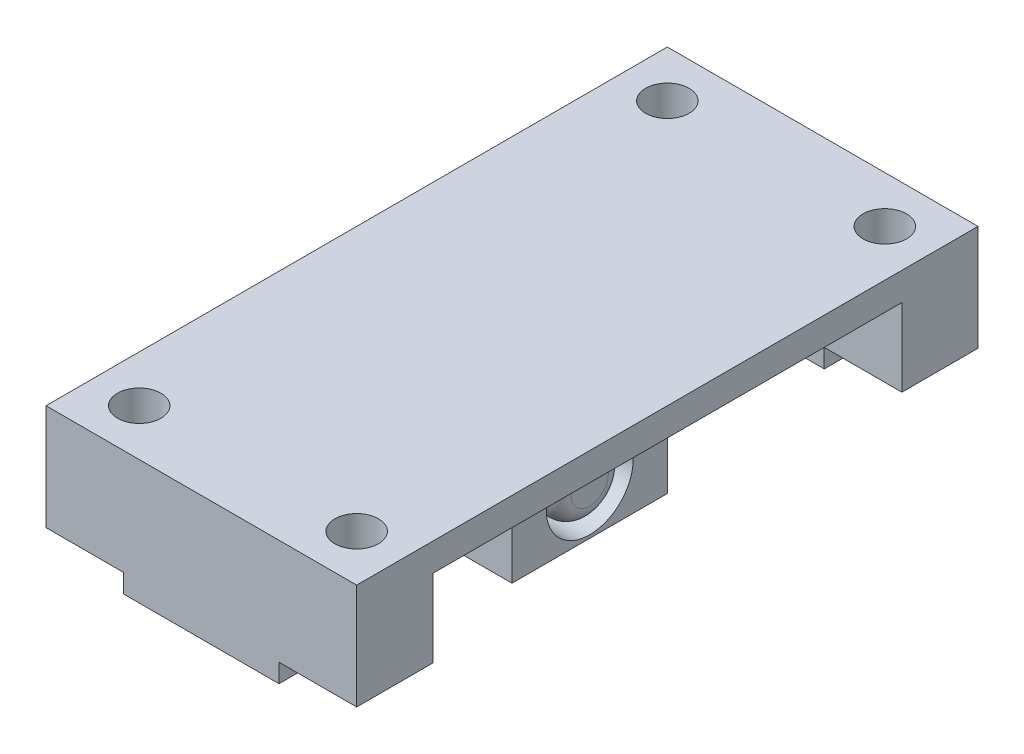
ISO-10303-21;
HEADER;
FILE_DESCRIPTION(('STEP AP214'),'2;1');
FILE_NAME('part.step','',(''),(''),'','','');
FILE_SCHEMA(('AUTOMOTIVE_DESIGN { 1 0 10303 214 1 1 1 1 }'));
ENDSEC;
DATA;
#1=APPLICATION_CONTEXT('core data for automotive mechanical design processes');
#2=APPLICATION_PROTOCOL_DEFINITION('international standard','automotive_design',2000,#1);
#3=PRODUCT_CONTEXT('',#1,'mechanical');
#4=PRODUCT('Part','Part','',(#3));
#5=PRODUCT_RELATED_PRODUCT_CATEGORY('part','',(#4));
#6=PRODUCT_DEFINITION_FORMATION('','',#4);
#7=PRODUCT_DEFINITION_CONTEXT('part definition',#1,'design');
#8=PRODUCT_DEFINITION('design','',#6,#7);
#9=PRODUCT_DEFINITION_SHAPE('','',#8);
#10=(LENGTH_UNIT() NAMED_UNIT(*) SI_UNIT(.MILLI.,.METRE.));
#11=(NAMED_UNIT(*) PLANE_ANGLE_UNIT() SI_UNIT($,.RADIAN.));
#12=(NAMED_UNIT(*) SI_UNIT($,.STERADIAN.) SOLID_ANGLE_UNIT());
#13=UNCERTAINTY_MEASURE_WITH_UNIT(LENGTH_MEASURE(1.E-05),#10,'distance_accuracy_value','');
#14=(GEOMETRIC_REPRESENTATION_CONTEXT(3) GLOBAL_UNCERTAINTY_ASSIGNED_CONTEXT((#13)) GLOBAL_UNIT_ASSIGNED_CONTEXT((#10,
#11,#12)) REPRESENTATION_CONTEXT('',''));
#15=CARTESIAN_POINT('',(0.,0.,0.));
#16=DIRECTION('',(0.,0.,1.));
#17=DIRECTION('',(1.,0.,0.));
#18=AXIS2_PLACEMENT_3D('',#15,#16,#17);
#19=CARTESIAN_POINT('',(5.,5.1,15.1));
#20=DIRECTION('',(0.,1.,0.));
#21=DIRECTION('',(0.,0.,1.));
#22=AXIS2_PLACEMENT_3D('',#19,#20,#21);
#23=PLANE('',#22);
#24=DIRECTION('',(0.,0.,1.));
#25=VECTOR('',#24,1.);
#26=CARTESIAN_POINT('',(5.,5.1,0.));
#27=LINE('',#26,#25);
#28=CARTESIAN_POINT('',(5.,5.1,-5.));
#29=VERTEX_POINT('',#28);
#30=CARTESIAN_POINT('',(5.,5.1,5.));
#31=VERTEX_POINT('',#30);
#32=EDGE_CURVE('E289',#29,#31,#27,.T.);
#33=ORIENTED_EDGE('',*,*,#32,.F.);
#34=DIRECTION('',(-1.,0.,0.));
#35=VECTOR('',#34,1.);
#36=CARTESIAN_POINT('',(5.,5.1,-5.));
#37=LINE('',#36,#35);
#38=CARTESIAN_POINT('',(-5.,5.1,-5.));
#39=VERTEX_POINT('',#38);
#40=EDGE_CURVE('E361',#29,#39,#37,.T.);
#41=ORIENTED_EDGE('',*,*,#40,.T.);
#42=DIRECTION('',(0.,0.,1.));
#43=VECTOR('',#42,1.);
#44=CARTESIAN_POINT('',(-5.,5.1,0.));
#45=LINE('',#44,#43);
#46=CARTESIAN_POINT('',(-5.,5.1,5.));
#47=VERTEX_POINT('',#46);
#48=EDGE_CURVE('E278',#39,#47,#45,.T.);
#49=ORIENTED_EDGE('',*,*,#48,.T.);
#50=DIRECTION('',(-1.,0.,0.));
#51=VECTOR('',#50,1.);
#52=CARTESIAN_POINT('',(5.,5.1,5.));
#53=LINE('',#52,#51);
#54=EDGE_CURVE('E338',#31,#47,#53,.T.);
#55=ORIENTED_EDGE('',*,*,#54,.F.);
#56=EDGE_LOOP('',(#33,#41,#49,#55));
#57=FACE_BOUND('',#56,.T.);
#58=DIRECTION('',(-1.,0.,0.));
#59=VECTOR('',#58,1.);
#60=CARTESIAN_POINT('',(5.,5.1,-15.1));
#61=LINE('',#60,#59);
#62=CARTESIAN_POINT('',(10.,5.1,-15.1));
#63=VERTEX_POINT('',#62);
#64=CARTESIAN_POINT('',(-10.,5.1,-15.1));
#65=VERTEX_POINT('',#64);
#66=EDGE_CURVE('E359',#63,#65,#61,.T.);
#67=ORIENTED_EDGE('',*,*,#66,.F.);
#68=DIRECTION('',(0.,0.,-1.));
#69=VECTOR('',#68,1.);
#70=CARTESIAN_POINT('',(10.,5.1,20.));
#71=LINE('',#70,#69);
#72=CARTESIAN_POINT('',(10.,5.1,15.1));
#73=VERTEX_POINT('',#72);
#74=EDGE_CURVE('E194',#73,#63,#71,.T.);
#75=ORIENTED_EDGE('',*,*,#74,.F.);
#76=DIRECTION('',(-1.,0.,0.));
#77=VECTOR('',#76,1.);
#78=CARTESIAN_POINT('',(5.,5.1,15.1));
#79=LINE('',#78,#77);
#80=CARTESIAN_POINT('',(-10.,5.1,15.1));
#81=VERTEX_POINT('',#80);
#82=EDGE_CURVE('E341',#73,#81,#79,.T.);
#83=ORIENTED_EDGE('',*,*,#82,.T.);
#84=DIRECTION('',(0.,0.,-1.));
#85=VECTOR('',#84,1.);
#86=CARTESIAN_POINT('',(-10.,5.1,20.));
#87=LINE('',#86,#85);
#88=EDGE_CURVE('E280',#81,#65,#87,.T.);
#89=ORIENTED_EDGE('',*,*,#88,.T.);
#90=EDGE_LOOP('',(#67,#75,#83,#89));
#91=FACE_BOUND('',#90,.T.);
#92=ADVANCED_FACE('F32',(#57,#91),#23,.F.);
#93=CARTESIAN_POINT('',(-5.,0.,0.));
#94=DIRECTION('',(1.,0.,0.));
#95=DIRECTION('',(0.,0.,-1.));
#96=AXIS2_PLACEMENT_3D('',#93,#94,#95);
#97=PLANE('',#96);
#98=DIRECTION('',(0.,0.,1.));
#99=VECTOR('',#98,1.);
#100=CARTESIAN_POINT('',(-5.,0.0999999999999994,-20.));
#101=LINE('',#100,#99);
#102=CARTESIAN_POINT('',(-5.,0.0999999999999985,-20.));
#103=VERTEX_POINT('',#102);
#104=CARTESIAN_POINT('',(-5.,0.0999999999999981,-15.1));
#105=VERTEX_POINT('',#104);
#106=EDGE_CURVE('E51',#103,#105,#101,.T.);
#107=ORIENTED_EDGE('',*,*,#106,.F.);
#108=DIRECTION('',(0.,1.,0.));
#109=VECTOR('',#108,1.);
#110=CARTESIAN_POINT('',(-5.,6.89681362906801,-20.));
#111=LINE('',#110,#109);
#112=CARTESIAN_POINT('',(-5.,-1.10318637093199,-20.));
#113=VERTEX_POINT('',#112);
#114=EDGE_CURVE('E321',#113,#103,#111,.T.);
#115=ORIENTED_EDGE('',*,*,#114,.F.);
#116=DIRECTION('',(0.,0.,-1.));
#117=VECTOR('',#116,1.);
#118=CARTESIAN_POINT('',(-5.,-1.10318637093199,-20.));
#119=LINE('',#118,#117);
#120=CARTESIAN_POINT('',(-5.,-1.10318637093199,-15.1));
#121=VERTEX_POINT('',#120);
#122=EDGE_CURVE('E319',#121,#113,#119,.T.);
#123=ORIENTED_EDGE('',*,*,#122,.F.);
#124=DIRECTION('',(0.,-1.,0.));
#125=VECTOR('',#124,1.);
#126=CARTESIAN_POINT('',(-5.,-1.10318637093199,-15.1));
#127=LINE('',#126,#125);
#128=EDGE_CURVE('E47',#105,#121,#127,.T.);
#129=ORIENTED_EDGE('',*,*,#128,.F.);
#130=EDGE_LOOP('',(#107,#115,#123,#129));
#131=FACE_BOUND('',#130,.T.);
#132=ADVANCED_FACE('F388',(#131),#97,.F.);
#133=CARTESIAN_POINT('',(5.,0.,0.));
#134=DIRECTION('',(1.,0.,0.));
#135=DIRECTION('',(0.,0.,-1.));
#136=AXIS2_PLACEMENT_3D('',#133,#134,#135);
#137=PLANE('',#136);
#138=DIRECTION('',(0.,1.,0.));
#139=VECTOR('',#138,1.);
#140=CARTESIAN_POINT('',(5.,-1.10318637093199,15.1));
#141=LINE('',#140,#139);
#142=CARTESIAN_POINT('',(5.,-1.10318637093199,15.1));
#143=VERTEX_POINT('',#142);
#144=CARTESIAN_POINT('',(5.,0.0999999999999968,15.1));
#145=VERTEX_POINT('',#144);
#146=EDGE_CURVE('E308',#143,#145,#141,.T.);
#147=ORIENTED_EDGE('',*,*,#146,.T.);
#148=DIRECTION('',(0.,0.,-1.));
#149=VECTOR('',#148,1.);
#150=CARTESIAN_POINT('',(5.,0.0999999999999968,15.1));
#151=LINE('',#150,#149);
#152=CARTESIAN_POINT('',(5.,0.0999999999999959,20.));
#153=VERTEX_POINT('',#152);
#154=EDGE_CURVE('E217',#153,#145,#151,.T.);
#155=ORIENTED_EDGE('',*,*,#154,.F.);
#156=DIRECTION('',(0.,-1.,0.));
#157=VECTOR('',#156,1.);
#158=CARTESIAN_POINT('',(5.,6.89681362906801,20.));
#159=LINE('',#158,#157);
#160=CARTESIAN_POINT('',(5.,-1.10318637093199,20.));
#161=VERTEX_POINT('',#160);
#162=EDGE_CURVE('E304',#153,#161,#159,.T.);
#163=ORIENTED_EDGE('',*,*,#162,.T.);
#164=DIRECTION('',(0.,0.,-1.));
#165=VECTOR('',#164,1.);
#166=CARTESIAN_POINT('',(5.,-1.10318637093199,20.));
#167=LINE('',#166,#165);
#168=EDGE_CURVE('E306',#161,#143,#167,.T.);
#169=ORIENTED_EDGE('',*,*,#168,.T.);
#170=EDGE_LOOP('',(#147,#155,#163,#169));
#171=FACE_BOUND('',#170,.T.);
#172=ADVANCED_FACE('F385',(#171),#137,.T.);
#173=CARTESIAN_POINT('',(5.,0.,0.));
#174=DIRECTION('',(-1.,0.,0.));
#175=DIRECTION('',(0.,0.,1.));
#176=AXIS2_PLACEMENT_3D('',#173,#174,#175);
#177=CYLINDRICAL_SURFACE('',#176,2.);
#178=CARTESIAN_POINT('',(-5.,0.,0.));
#179=DIRECTION('',(1.,0.,0.));
#180=DIRECTION('',(0.,0.,-1.));
#181=AXIS2_PLACEMENT_3D('',#178,#179,#180);
#182=CIRCLE('',#181,2.);
#183=CARTESIAN_POINT('',(-5.,0.,-2.));
#184=VERTEX_POINT('',#183);
#185=EDGE_CURVE('E291',#184,#184,#182,.T.);
#186=ORIENTED_EDGE('',*,*,#185,.F.);
#187=EDGE_LOOP('',(#186));
#188=FACE_BOUND('',#187,.T.);
#189=CARTESIAN_POINT('',(-2.,0.,0.));
#190=DIRECTION('',(1.,0.,0.));
#191=DIRECTION('',(0.,0.,-1.));
#192=AXIS2_PLACEMENT_3D('',#189,#190,#191);
#193=CIRCLE('',#192,2.);
#194=CARTESIAN_POINT('',(-2.,0.,-2.));
#195=VERTEX_POINT('',#194);
#196=EDGE_CURVE('E253',#195,#195,#193,.T.);
#197=ORIENTED_EDGE('',*,*,#196,.T.);
#198=EDGE_LOOP('',(#197));
#199=FACE_BOUND('',#198,.T.);
#200=ADVANCED_FACE('F465',(#188,#199),#177,.F.);
#201=DIRECTION('',(0.,0.,-1.));
#202=VECTOR('',#201,1.);
#203=CARTESIAN_POINT('',(5.,0.0999999999999994,-20.));
#204=LINE('',#203,#202);
#205=CARTESIAN_POINT('',(5.,0.0999999999999985,-15.1));
#206=VERTEX_POINT('',#205);
#207=CARTESIAN_POINT('',(5.,0.0999999999999994,-20.));
#208=VERTEX_POINT('',#207);
#209=EDGE_CURVE('E178',#206,#208,#204,.T.);
#210=ORIENTED_EDGE('',*,*,#209,.F.);
#211=DIRECTION('',(0.,-1.,0.));
#212=VECTOR('',#211,1.);
#213=CARTESIAN_POINT('',(5.,-1.10318637093199,-15.1));
#214=LINE('',#213,#212);
#215=CARTESIAN_POINT('',(5.,-1.10318637093199,-15.1));
#216=VERTEX_POINT('',#215);
#217=EDGE_CURVE('E175',#206,#216,#214,.T.);
#218=ORIENTED_EDGE('',*,*,#217,.T.);
#219=DIRECTION('',(0.,0.,-1.));
#220=VECTOR('',#219,1.);
#221=CARTESIAN_POINT('',(5.,-1.10318637093199,-20.));
#222=LINE('',#221,#220);
#223=CARTESIAN_POINT('',(5.,-1.10318637093199,-20.));
#224=VERTEX_POINT('',#223);
#225=EDGE_CURVE('E299',#216,#224,#222,.T.);
#226=ORIENTED_EDGE('',*,*,#225,.T.);
#227=DIRECTION('',(0.,1.,0.));
#228=VECTOR('',#227,1.);
#229=CARTESIAN_POINT('',(5.,6.89681362906801,-20.));
#230=LINE('',#229,#228);
#231=EDGE_CURVE('E301',#224,#208,#230,.T.);
#232=ORIENTED_EDGE('',*,*,#231,.T.);
#233=EDGE_LOOP('',(#210,#218,#226,#232));
#234=FACE_BOUND('',#233,.T.);
#235=ADVANCED_FACE('F462',(#234),#137,.T.);
#236=CARTESIAN_POINT('',(5.,0.,0.));
#237=DIRECTION('',(1.,0.,0.));
#238=DIRECTION('',(0.,0.,-1.));
#239=AXIS2_PLACEMENT_3D('',#236,#237,#238);
#240=CIRCLE('',#239,2.8);
#241=CARTESIAN_POINT('',(5.,0.,-2.8));
#242=VERTEX_POINT('',#241);
#243=EDGE_CURVE('E249',#242,#242,#240,.T.);
#244=ORIENTED_EDGE('',*,*,#243,.F.);
#245=EDGE_LOOP('',(#244));
#246=FACE_BOUND('',#245,.T.);
#247=DIRECTION('',(0.,1.,0.));
#248=VECTOR('',#247,1.);
#249=CARTESIAN_POINT('',(5.,5.1,-5.));
#250=LINE('',#249,#248);
#251=CARTESIAN_POINT('',(5.,-3.,-5.));
#252=VERTEX_POINT('',#251);
#253=EDGE_CURVE('E295',#252,#29,#250,.T.);
#254=ORIENTED_EDGE('',*,*,#253,.T.);
#255=ORIENTED_EDGE('',*,*,#32,.T.);
#256=DIRECTION('',(0.,-1.,0.));
#257=VECTOR('',#256,1.);
#258=CARTESIAN_POINT('',(5.,5.1,5.));
#259=LINE('',#258,#257);
#260=CARTESIAN_POINT('',(5.,-3.,5.));
#261=VERTEX_POINT('',#260);
#262=EDGE_CURVE('E311',#31,#261,#259,.T.);
#263=ORIENTED_EDGE('',*,*,#262,.T.);
#264=DIRECTION('',(0.,0.,-1.));
#265=VECTOR('',#264,1.);
#266=CARTESIAN_POINT('',(5.,-3.,5.));
#267=LINE('',#266,#265);
#268=EDGE_CURVE('E313',#261,#252,#267,.T.);
#269=ORIENTED_EDGE('',*,*,#268,.T.);
#270=EDGE_LOOP('',(#254,#255,#263,#269));
#271=FACE_BOUND('',#270,.T.);
#272=ADVANCED_FACE('F384',(#246,#271),#137,.T.);
#273=ORIENTED_EDGE('',*,*,#185,.T.);
#274=EDGE_LOOP('',(#273));
#275=FACE_BOUND('',#274,.T.);
#276=ORIENTED_EDGE('',*,*,#48,.F.);
#277=DIRECTION('',(0.,1.,0.));
#278=VECTOR('',#277,1.);
#279=CARTESIAN_POINT('',(-5.,5.1,-5.));
#280=LINE('',#279,#278);
#281=CARTESIAN_POINT('',(-5.,-3.,-5.));
#282=VERTEX_POINT('',#281);
#283=EDGE_CURVE('E294',#282,#39,#280,.T.);
#284=ORIENTED_EDGE('',*,*,#283,.F.);
#285=DIRECTION('',(0.,0.,-1.));
#286=VECTOR('',#285,1.);
#287=CARTESIAN_POINT('',(-5.,-3.,5.));
#288=LINE('',#287,#286);
#289=CARTESIAN_POINT('',(-5.,-3.,5.));
#290=VERTEX_POINT('',#289);
#291=EDGE_CURVE('E297',#290,#282,#288,.T.);
#292=ORIENTED_EDGE('',*,*,#291,.F.);
#293=DIRECTION('',(0.,-1.,0.));
#294=VECTOR('',#293,1.);
#295=CARTESIAN_POINT('',(-5.,5.1,5.));
#296=LINE('',#295,#294);
#297=EDGE_CURVE('E330',#47,#290,#296,.T.);
#298=ORIENTED_EDGE('',*,*,#297,.F.);
#299=EDGE_LOOP('',(#276,#284,#292,#298));
#300=FACE_BOUND('',#299,.T.);
#301=ADVANCED_FACE('F395',(#275,#300),#97,.F.);
#302=DIRECTION('',(0.,-1.,0.));
#303=VECTOR('',#302,1.);
#304=CARTESIAN_POINT('',(-5.,6.89681362906801,20.));
#305=LINE('',#304,#303);
#306=CARTESIAN_POINT('',(-5.,0.0999999999999959,20.));
#307=VERTEX_POINT('',#306);
#308=CARTESIAN_POINT('',(-5.,-1.10318637093199,20.));
#309=VERTEX_POINT('',#308);
#310=EDGE_CURVE('E323',#307,#309,#305,.T.);
#311=ORIENTED_EDGE('',*,*,#310,.F.);
#312=DIRECTION('',(0.,0.,1.));
#313=VECTOR('',#312,1.);
#314=CARTESIAN_POINT('',(-5.,0.0999999999999968,15.1));
#315=LINE('',#314,#313);
#316=CARTESIAN_POINT('',(-5.,0.0999999999999955,15.1));
#317=VERTEX_POINT('',#316);
#318=EDGE_CURVE('E232',#317,#307,#315,.T.);
#319=ORIENTED_EDGE('',*,*,#318,.F.);
#320=DIRECTION('',(0.,1.,0.));
#321=VECTOR('',#320,1.);
#322=CARTESIAN_POINT('',(-5.,-1.10318637093199,15.1));
#323=LINE('',#322,#321);
#324=CARTESIAN_POINT('',(-5.,-1.10318637093199,15.1));
#325=VERTEX_POINT('',#324);
#326=EDGE_CURVE('E327',#325,#317,#323,.T.);
#327=ORIENTED_EDGE('',*,*,#326,.F.);
#328=DIRECTION('',(0.,0.,-1.));
#329=VECTOR('',#328,1.);
#330=CARTESIAN_POINT('',(-5.,-1.10318637093199,20.));
#331=LINE('',#330,#329);
#332=EDGE_CURVE('E325',#309,#325,#331,.T.);
#333=ORIENTED_EDGE('',*,*,#332,.F.);
#334=EDGE_LOOP('',(#311,#319,#327,#333));
#335=FACE_BOUND('',#334,.T.);
#336=ADVANCED_FACE('F396',(#335),#97,.F.);
#337=CARTESIAN_POINT('',(5.,5.1,-5.));
#338=DIRECTION('',(0.,0.,1.));
#339=DIRECTION('',(0.,-1.,0.));
#340=AXIS2_PLACEMENT_3D('',#337,#338,#339);
#341=PLANE('',#340);
#342=ORIENTED_EDGE('',*,*,#283,.T.);
#343=ORIENTED_EDGE('',*,*,#40,.F.);
#344=ORIENTED_EDGE('',*,*,#253,.F.);
#345=DIRECTION('',(-1.,0.,0.));
#346=VECTOR('',#345,1.);
#347=CARTESIAN_POINT('',(5.,-3.,-5.));
#348=LINE('',#347,#346);
#349=EDGE_CURVE('E315',#252,#282,#348,.T.);
#350=ORIENTED_EDGE('',*,*,#349,.T.);
#351=EDGE_LOOP('',(#342,#343,#344,#350));
#352=FACE_BOUND('',#351,.T.);
#353=ADVANCED_FACE('F428',(#352),#341,.F.);
#354=CARTESIAN_POINT('',(5.,-1.10318637093199,-15.1));
#355=DIRECTION('',(0.,0.,-1.));
#356=DIRECTION('',(-1.,0.,0.));
#357=AXIS2_PLACEMENT_3D('',#354,#355,#356);
#358=PLANE('',#357);
#359=ORIENTED_EDGE('',*,*,#66,.T.);
#360=DIRECTION('',(0.,1.,0.));
#361=VECTOR('',#360,1.);
#362=CARTESIAN_POINT('',(-10.,0.0999999999999985,-15.1));
#363=LINE('',#362,#361);
#364=CARTESIAN_POINT('',(-10.,0.0999999999999985,-15.1));
#365=VERTEX_POINT('',#364);
#366=EDGE_CURVE('E211',#365,#65,#363,.T.);
#367=ORIENTED_EDGE('',*,*,#366,.F.);
#368=DIRECTION('',(-1.,0.,0.));
#369=VECTOR('',#368,1.);
#370=CARTESIAN_POINT('',(-10.,0.0999999999999985,-15.1));
#371=LINE('',#370,#369);
#372=EDGE_CURVE('E209',#105,#365,#371,.T.);
#373=ORIENTED_EDGE('',*,*,#372,.F.);
#374=ORIENTED_EDGE('',*,*,#128,.T.);
#375=DIRECTION('',(-1.,0.,0.));
#376=VECTOR('',#375,1.);
#377=CARTESIAN_POINT('',(5.,-1.10318637093199,-15.1));
#378=LINE('',#377,#376);
#379=EDGE_CURVE('E356',#216,#121,#378,.T.);
#380=ORIENTED_EDGE('',*,*,#379,.F.);
#381=ORIENTED_EDGE('',*,*,#217,.F.);
#382=DIRECTION('',(-1.,0.,0.));
#383=VECTOR('',#382,1.);
#384=CARTESIAN_POINT('',(10.,0.0999999999999985,-15.1));
#385=LINE('',#384,#383);
#386=CARTESIAN_POINT('',(10.,0.0999999999999985,-15.1));
#387=VERTEX_POINT('',#386);
#388=EDGE_CURVE('E168',#387,#206,#385,.T.);
#389=ORIENTED_EDGE('',*,*,#388,.F.);
#390=DIRECTION('',(0.,1.,0.));
#391=VECTOR('',#390,1.);
#392=CARTESIAN_POINT('',(10.,0.0999999999999985,-15.1));
#393=LINE('',#392,#391);
#394=EDGE_CURVE('E172',#387,#63,#393,.T.);
#395=ORIENTED_EDGE('',*,*,#394,.T.);
#396=EDGE_LOOP('',(#359,#367,#373,#374,#380,#381,#389,#395));
#397=FACE_BOUND('',#396,.T.);
#398=ADVANCED_FACE('F170',(#397),#358,.F.);
#399=CARTESIAN_POINT('',(5.,-1.10318637093199,-20.));
#400=DIRECTION('',(0.,1.,0.));
#401=DIRECTION('',(0.,0.,1.));
#402=AXIS2_PLACEMENT_3D('',#399,#400,#401);
#403=PLANE('',#402);
#404=ORIENTED_EDGE('',*,*,#122,.T.);
#405=DIRECTION('',(-1.,0.,0.));
#406=VECTOR('',#405,1.);
#407=CARTESIAN_POINT('',(5.,-1.10318637093199,-20.));
#408=LINE('',#407,#406);
#409=EDGE_CURVE('E353',#224,#113,#408,.T.);
#410=ORIENTED_EDGE('',*,*,#409,.F.);
#411=ORIENTED_EDGE('',*,*,#225,.F.);
#412=ORIENTED_EDGE('',*,*,#379,.T.);
#413=EDGE_LOOP('',(#404,#410,#411,#412));
#414=FACE_BOUND('',#413,.T.);
#415=ADVANCED_FACE('F422',(#414),#403,.F.);
#416=CARTESIAN_POINT('',(5.,6.89681362906801,-20.));
#417=DIRECTION('',(0.,0.,1.));
#418=DIRECTION('',(0.,-1.,0.));
#419=AXIS2_PLACEMENT_3D('',#416,#417,#418);
#420=PLANE('',#419);
#421=DIRECTION('',(1.,0.,0.));
#422=VECTOR('',#421,1.);
#423=CARTESIAN_POINT('',(-10.,0.0999999999999994,-20.));
#424=LINE('',#423,#422);
#425=CARTESIAN_POINT('',(-10.,0.0999999999999994,-20.));
#426=VERTEX_POINT('',#425);
#427=EDGE_CURVE('E205',#426,#103,#424,.T.);
#428=ORIENTED_EDGE('',*,*,#427,.F.);
#429=DIRECTION('',(0.,1.,0.));
#430=VECTOR('',#429,1.);
#431=CARTESIAN_POINT('',(-10.,6.89681362906801,-20.));
#432=LINE('',#431,#430);
#433=CARTESIAN_POINT('',(-10.,6.89681362906801,-20.));
#434=VERTEX_POINT('',#433);
#435=EDGE_CURVE('E283',#426,#434,#432,.T.);
#436=ORIENTED_EDGE('',*,*,#435,.T.);
#437=DIRECTION('',(-1.,0.,0.));
#438=VECTOR('',#437,1.);
#439=CARTESIAN_POINT('',(5.,6.89681362906801,-20.));
#440=LINE('',#439,#438);
#441=CARTESIAN_POINT('',(10.,6.89681362906801,-20.));
#442=VERTEX_POINT('',#441);
#443=EDGE_CURVE('E351',#442,#434,#440,.T.);
#444=ORIENTED_EDGE('',*,*,#443,.F.);
#445=DIRECTION('',(0.,1.,0.));
#446=VECTOR('',#445,1.);
#447=CARTESIAN_POINT('',(10.,6.89681362906801,-20.));
#448=LINE('',#447,#446);
#449=CARTESIAN_POINT('',(10.,0.0999999999999994,-20.));
#450=VERTEX_POINT('',#449);
#451=EDGE_CURVE('E273',#450,#442,#448,.T.);
#452=ORIENTED_EDGE('',*,*,#451,.F.);
#453=DIRECTION('',(1.,0.,0.));
#454=VECTOR('',#453,1.);
#455=CARTESIAN_POINT('',(10.,0.0999999999999994,-20.));
#456=LINE('',#455,#454);
#457=EDGE_CURVE('E186',#208,#450,#456,.T.);
#458=ORIENTED_EDGE('',*,*,#457,.F.);
#459=ORIENTED_EDGE('',*,*,#231,.F.);
#460=ORIENTED_EDGE('',*,*,#409,.T.);
#461=ORIENTED_EDGE('',*,*,#114,.T.);
#462=EDGE_LOOP('',(#428,#436,#444,#452,#458,#459,#460,#461));
#463=FACE_BOUND('',#462,.T.);
#464=ADVANCED_FACE('F418',(#463),#420,.F.);
#465=CARTESIAN_POINT('',(5.,6.89681362906801,-20.));
#466=DIRECTION('',(0.,-1.,0.));
#467=DIRECTION('',(0.,0.,-1.));
#468=AXIS2_PLACEMENT_3D('',#465,#466,#467);
#469=PLANE('',#468);
#470=CARTESIAN_POINT('',(-7.,6.89681362906801,-17.));
#471=DIRECTION('',(0.,-1.,0.));
#472=DIRECTION('',(0.,0.,-1.));
#473=AXIS2_PLACEMENT_3D('',#470,#471,#472);
#474=CIRCLE('',#473,1.4);
#475=CARTESIAN_POINT('',(-7.,6.89681362906801,-18.4));
#476=VERTEX_POINT('',#475);
#477=EDGE_CURVE('E256',#476,#476,#474,.F.);
#478=ORIENTED_EDGE('',*,*,#477,.F.);
#479=EDGE_LOOP('',(#478));
#480=FACE_BOUND('',#479,.T.);
#481=CARTESIAN_POINT('',(7.,6.89681362906801,-17.));
#482=DIRECTION('',(0.,-1.,0.));
#483=DIRECTION('',(0.,0.,-1.));
#484=AXIS2_PLACEMENT_3D('',#481,#482,#483);
#485=CIRCLE('',#484,1.4);
#486=CARTESIAN_POINT('',(7.,6.89681362906801,-18.4));
#487=VERTEX_POINT('',#486);
#488=EDGE_CURVE('E259',#487,#487,#485,.F.);
#489=ORIENTED_EDGE('',*,*,#488,.F.);
#490=EDGE_LOOP('',(#489));
#491=FACE_BOUND('',#490,.T.);
#492=CARTESIAN_POINT('',(7.,6.89681362906801,17.));
#493=DIRECTION('',(0.,-1.,0.));
#494=DIRECTION('',(0.,0.,-1.));
#495=AXIS2_PLACEMENT_3D('',#492,#493,#494);
#496=CIRCLE('',#495,1.4);
#497=CARTESIAN_POINT('',(7.,6.89681362906801,15.6));
#498=VERTEX_POINT('',#497);
#499=EDGE_CURVE('E262',#498,#498,#496,.F.);
#500=ORIENTED_EDGE('',*,*,#499,.F.);
#501=EDGE_LOOP('',(#500));
#502=FACE_BOUND('',#501,.T.);
#503=CARTESIAN_POINT('',(-7.,6.89681362906801,17.));
#504=DIRECTION('',(0.,-1.,0.));
#505=DIRECTION('',(0.,0.,-1.));
#506=AXIS2_PLACEMENT_3D('',#503,#504,#505);
#507=CIRCLE('',#506,1.4);
#508=CARTESIAN_POINT('',(-7.,6.89681362906801,15.6));
#509=VERTEX_POINT('',#508);
#510=EDGE_CURVE('E265',#509,#509,#507,.F.);
#511=ORIENTED_EDGE('',*,*,#510,.F.);
#512=EDGE_LOOP('',(#511));
#513=FACE_BOUND('',#512,.T.);
#514=ORIENTED_EDGE('',*,*,#443,.T.);
#515=DIRECTION('',(0.,0.,1.));
#516=VECTOR('',#515,1.);
#517=CARTESIAN_POINT('',(-10.,6.89681362906801,20.));
#518=LINE('',#517,#516);
#519=CARTESIAN_POINT('',(-10.,6.89681362906801,20.));
#520=VERTEX_POINT('',#519);
#521=EDGE_CURVE('E271',#434,#520,#518,.T.);
#522=ORIENTED_EDGE('',*,*,#521,.T.);
#523=DIRECTION('',(-1.,0.,0.));
#524=VECTOR('',#523,1.);
#525=CARTESIAN_POINT('',(5.,6.89681362906801,20.));
#526=LINE('',#525,#524);
#527=CARTESIAN_POINT('',(10.,6.89681362906801,20.));
#528=VERTEX_POINT('',#527);
#529=EDGE_CURVE('E349',#528,#520,#526,.T.);
#530=ORIENTED_EDGE('',*,*,#529,.F.);
#531=DIRECTION('',(0.,0.,1.));
#532=VECTOR('',#531,1.);
#533=CARTESIAN_POINT('',(10.,6.89681362906801,20.));
#534=LINE('',#533,#532);
#535=EDGE_CURVE('E275',#442,#528,#534,.T.);
#536=ORIENTED_EDGE('',*,*,#535,.F.);
#537=EDGE_LOOP('',(#514,#522,#530,#536));
#538=FACE_BOUND('',#537,.T.);
#539=ADVANCED_FACE('F414',(#480,#491,#502,#513,#538),#469,.F.);
#540=CARTESIAN_POINT('',(5.,6.89681362906801,20.));
#541=DIRECTION('',(0.,0.,-1.));
#542=DIRECTION('',(0.,1.,0.));
#543=AXIS2_PLACEMENT_3D('',#540,#541,#542);
#544=PLANE('',#543);
#545=DIRECTION('',(-1.,0.,0.));
#546=VECTOR('',#545,1.);
#547=CARTESIAN_POINT('',(-5.,0.0999999999999959,20.));
#548=LINE('',#547,#546);
#549=CARTESIAN_POINT('',(-10.,0.0999999999999959,20.));
#550=VERTEX_POINT('',#549);
#551=EDGE_CURVE('E235',#307,#550,#548,.T.);
#552=ORIENTED_EDGE('',*,*,#551,.F.);
#553=ORIENTED_EDGE('',*,*,#310,.T.);
#554=DIRECTION('',(-1.,0.,0.));
#555=VECTOR('',#554,1.);
#556=CARTESIAN_POINT('',(5.,-1.10318637093199,20.));
#557=LINE('',#556,#555);
#558=EDGE_CURVE('E346',#161,#309,#557,.T.);
#559=ORIENTED_EDGE('',*,*,#558,.F.);
#560=ORIENTED_EDGE('',*,*,#162,.F.);
#561=DIRECTION('',(-1.,0.,0.));
#562=VECTOR('',#561,1.);
#563=CARTESIAN_POINT('',(5.,0.0999999999999959,20.));
#564=LINE('',#563,#562);
#565=CARTESIAN_POINT('',(10.,0.0999999999999959,20.));
#566=VERTEX_POINT('',#565);
#567=EDGE_CURVE('E225',#566,#153,#564,.T.);
#568=ORIENTED_EDGE('',*,*,#567,.F.);
#569=DIRECTION('',(0.,-1.,0.));
#570=VECTOR('',#569,1.);
#571=CARTESIAN_POINT('',(10.,6.89681362906801,20.));
#572=LINE('',#571,#570);
#573=EDGE_CURVE('E269',#528,#566,#572,.T.);
#574=ORIENTED_EDGE('',*,*,#573,.F.);
#575=ORIENTED_EDGE('',*,*,#529,.T.);
#576=DIRECTION('',(0.,-1.,0.));
#577=VECTOR('',#576,1.);
#578=CARTESIAN_POINT('',(-10.,6.89681362906801,20.));
#579=LINE('',#578,#577);
#580=EDGE_CURVE('E268',#520,#550,#579,.T.);
#581=ORIENTED_EDGE('',*,*,#580,.T.);
#582=EDGE_LOOP('',(#552,#553,#559,#560,#568,#574,#575,#581));
#583=FACE_BOUND('',#582,.T.);
#584=ADVANCED_FACE('F410',(#583),#544,.F.);
#585=CARTESIAN_POINT('',(5.,-1.10318637093199,20.));
#586=DIRECTION('',(0.,1.,0.));
#587=DIRECTION('',(0.,0.,1.));
#588=AXIS2_PLACEMENT_3D('',#585,#586,#587);
#589=PLANE('',#588);
#590=ORIENTED_EDGE('',*,*,#332,.T.);
#591=DIRECTION('',(-1.,0.,0.));
#592=VECTOR('',#591,1.);
#593=CARTESIAN_POINT('',(5.,-1.10318637093199,15.1));
#594=LINE('',#593,#592);
#595=EDGE_CURVE('E343',#143,#325,#594,.T.);
#596=ORIENTED_EDGE('',*,*,#595,.F.);
#597=ORIENTED_EDGE('',*,*,#168,.F.);
#598=ORIENTED_EDGE('',*,*,#558,.T.);
#599=EDGE_LOOP('',(#590,#596,#597,#598));
#600=FACE_BOUND('',#599,.T.);
#601=ADVANCED_FACE('F406',(#600),#589,.F.);
#602=CARTESIAN_POINT('',(5.,-1.10318637093199,15.1));
#603=DIRECTION('',(0.,0.,1.));
#604=DIRECTION('',(1.,0.,0.));
#605=AXIS2_PLACEMENT_3D('',#602,#603,#604);
#606=PLANE('',#605);
#607=ORIENTED_EDGE('',*,*,#326,.T.);
#608=DIRECTION('',(1.,0.,0.));
#609=VECTOR('',#608,1.);
#610=CARTESIAN_POINT('',(-5.,0.0999999999999968,15.1));
#611=LINE('',#610,#609);
#612=CARTESIAN_POINT('',(-10.,0.0999999999999968,15.1));
#613=VERTEX_POINT('',#612);
#614=EDGE_CURVE('E240',#613,#317,#611,.T.);
#615=ORIENTED_EDGE('',*,*,#614,.F.);
#616=DIRECTION('',(0.,1.,0.));
#617=VECTOR('',#616,1.);
#618=CARTESIAN_POINT('',(-10.,0.0999999999999968,15.1));
#619=LINE('',#618,#617);
#620=EDGE_CURVE('E243',#613,#81,#619,.T.);
#621=ORIENTED_EDGE('',*,*,#620,.T.);
#622=ORIENTED_EDGE('',*,*,#82,.F.);
#623=DIRECTION('',(0.,1.,0.));
#624=VECTOR('',#623,1.);
#625=CARTESIAN_POINT('',(10.,0.0999999999999968,15.1));
#626=LINE('',#625,#624);
#627=CARTESIAN_POINT('',(10.,0.0999999999999968,15.1));
#628=VERTEX_POINT('',#627);
#629=EDGE_CURVE('E227',#628,#73,#626,.T.);
#630=ORIENTED_EDGE('',*,*,#629,.F.);
#631=DIRECTION('',(1.,0.,0.));
#632=VECTOR('',#631,1.);
#633=CARTESIAN_POINT('',(5.,0.0999999999999968,15.1));
#634=LINE('',#633,#632);
#635=EDGE_CURVE('E220',#145,#628,#634,.T.);
#636=ORIENTED_EDGE('',*,*,#635,.F.);
#637=ORIENTED_EDGE('',*,*,#146,.F.);
#638=ORIENTED_EDGE('',*,*,#595,.T.);
#639=EDGE_LOOP('',(#607,#615,#621,#622,#630,#636,#637,#638));
#640=FACE_BOUND('',#639,.T.);
#641=ADVANCED_FACE('F403',(#640),#606,.F.);
#642=CARTESIAN_POINT('',(5.,5.1,5.));
#643=DIRECTION('',(0.,0.,-1.));
#644=DIRECTION('',(0.,1.,0.));
#645=AXIS2_PLACEMENT_3D('',#642,#643,#644);
#646=PLANE('',#645);
#647=ORIENTED_EDGE('',*,*,#297,.T.);
#648=DIRECTION('',(-1.,0.,0.));
#649=VECTOR('',#648,1.);
#650=CARTESIAN_POINT('',(5.,-3.,5.));
#651=LINE('',#650,#649);
#652=EDGE_CURVE('E335',#261,#290,#651,.T.);
#653=ORIENTED_EDGE('',*,*,#652,.F.);
#654=ORIENTED_EDGE('',*,*,#262,.F.);
#655=ORIENTED_EDGE('',*,*,#54,.T.);
#656=EDGE_LOOP('',(#647,#653,#654,#655));
#657=FACE_BOUND('',#656,.T.);
#658=ADVANCED_FACE('F401',(#657),#646,.F.);
#659=CARTESIAN_POINT('',(5.,-3.,5.));
#660=DIRECTION('',(0.,1.,0.));
#661=DIRECTION('',(0.,0.,1.));
#662=AXIS2_PLACEMENT_3D('',#659,#660,#661);
#663=PLANE('',#662);
#664=ORIENTED_EDGE('',*,*,#291,.T.);
#665=ORIENTED_EDGE('',*,*,#349,.F.);
#666=ORIENTED_EDGE('',*,*,#268,.F.);
#667=ORIENTED_EDGE('',*,*,#652,.T.);
#668=EDGE_LOOP('',(#664,#665,#666,#667));
#669=FACE_BOUND('',#668,.T.);
#670=ADVANCED_FACE('F449',(#669),#663,.F.);
#671=CARTESIAN_POINT('',(-10.,0.,0.));
#672=DIRECTION('',(1.,0.,0.));
#673=DIRECTION('',(0.,0.,-1.));
#674=AXIS2_PLACEMENT_3D('',#671,#672,#673);
#675=PLANE('',#674);
#676=ORIENTED_EDGE('',*,*,#580,.F.);
#677=ORIENTED_EDGE('',*,*,#521,.F.);
#678=ORIENTED_EDGE('',*,*,#435,.F.);
#679=DIRECTION('',(0.,0.,-1.));
#680=VECTOR('',#679,1.);
#681=CARTESIAN_POINT('',(-10.,0.0999999999999994,-20.));
#682=LINE('',#681,#680);
#683=EDGE_CURVE('E198',#365,#426,#682,.T.);
#684=ORIENTED_EDGE('',*,*,#683,.F.);
#685=ORIENTED_EDGE('',*,*,#366,.T.);
#686=ORIENTED_EDGE('',*,*,#88,.F.);
#687=ORIENTED_EDGE('',*,*,#620,.F.);
#688=DIRECTION('',(0.,0.,-1.));
#689=VECTOR('',#688,1.);
#690=CARTESIAN_POINT('',(-10.,0.0999999999999968,15.1));
#691=LINE('',#690,#689);
#692=EDGE_CURVE('E238',#550,#613,#691,.T.);
#693=ORIENTED_EDGE('',*,*,#692,.F.);
#694=EDGE_LOOP('',(#676,#677,#678,#684,#685,#686,#687,#693));
#695=FACE_BOUND('',#694,.T.);
#696=ADVANCED_FACE('F455',(#695),#675,.F.);
#697=CARTESIAN_POINT('',(10.,0.,0.));
#698=DIRECTION('',(1.,0.,0.));
#699=DIRECTION('',(0.,0.,-1.));
#700=AXIS2_PLACEMENT_3D('',#697,#698,#699);
#701=PLANE('',#700);
#702=ORIENTED_EDGE('',*,*,#573,.T.);
#703=DIRECTION('',(0.,0.,1.));
#704=VECTOR('',#703,1.);
#705=CARTESIAN_POINT('',(10.,0.0999999999999968,15.1));
#706=LINE('',#705,#704);
#707=EDGE_CURVE('E222',#628,#566,#706,.T.);
#708=ORIENTED_EDGE('',*,*,#707,.F.);
#709=ORIENTED_EDGE('',*,*,#629,.T.);
#710=ORIENTED_EDGE('',*,*,#74,.T.);
#711=ORIENTED_EDGE('',*,*,#394,.F.);
#712=DIRECTION('',(0.,0.,1.));
#713=VECTOR('',#712,1.);
#714=CARTESIAN_POINT('',(10.,0.0999999999999994,-20.));
#715=LINE('',#714,#713);
#716=EDGE_CURVE('E179',#450,#387,#715,.T.);
#717=ORIENTED_EDGE('',*,*,#716,.F.);
#718=ORIENTED_EDGE('',*,*,#451,.T.);
#719=ORIENTED_EDGE('',*,*,#535,.T.);
#720=EDGE_LOOP('',(#702,#708,#709,#710,#711,#717,#718,#719));
#721=FACE_BOUND('',#720,.T.);
#722=ADVANCED_FACE('F191',(#721),#701,.T.);
#723=CARTESIAN_POINT('',(-7.,20.,17.));
#724=DIRECTION('',(0.,-1.,0.));
#725=DIRECTION('',(0.,0.,-1.));
#726=AXIS2_PLACEMENT_3D('',#723,#724,#725);
#727=CYLINDRICAL_SURFACE('',#726,1.4);
#728=ORIENTED_EDGE('',*,*,#510,.T.);
#729=EDGE_LOOP('',(#728));
#730=FACE_BOUND('',#729,.T.);
#731=CARTESIAN_POINT('',(-7.,0.0999999999999959,17.));
#732=DIRECTION('',(0.,-1.,0.));
#733=DIRECTION('',(0.,0.,-1.));
#734=AXIS2_PLACEMENT_3D('',#731,#732,#733);
#735=CIRCLE('',#734,1.4);
#736=CARTESIAN_POINT('',(-7.,0.0999999999999961,15.6));
#737=VERTEX_POINT('',#736);
#738=EDGE_CURVE('E229',#737,#737,#735,.T.);
#739=ORIENTED_EDGE('',*,*,#738,.T.);
#740=EDGE_LOOP('',(#739));
#741=FACE_BOUND('',#740,.T.);
#742=ADVANCED_FACE('F472',(#730,#741),#727,.F.);
#743=CARTESIAN_POINT('',(7.,20.,17.));
#744=DIRECTION('',(0.,-1.,0.));
#745=DIRECTION('',(0.,0.,-1.));
#746=AXIS2_PLACEMENT_3D('',#743,#744,#745);
#747=CYLINDRICAL_SURFACE('',#746,1.4);
#748=ORIENTED_EDGE('',*,*,#499,.T.);
#749=EDGE_LOOP('',(#748));
#750=FACE_BOUND('',#749,.T.);
#751=CARTESIAN_POINT('',(7.,0.0999999999999959,17.));
#752=DIRECTION('',(0.,-1.,0.));
#753=DIRECTION('',(0.,0.,-1.));
#754=AXIS2_PLACEMENT_3D('',#751,#752,#753);
#755=CIRCLE('',#754,1.4);
#756=CARTESIAN_POINT('',(7.,0.0999999999999961,15.6));
#757=VERTEX_POINT('',#756);
#758=EDGE_CURVE('E214',#757,#757,#755,.T.);
#759=ORIENTED_EDGE('',*,*,#758,.T.);
#760=EDGE_LOOP('',(#759));
#761=FACE_BOUND('',#760,.T.);
#762=ADVANCED_FACE('F475',(#750,#761),#747,.F.);
#763=CARTESIAN_POINT('',(7.,20.,-17.));
#764=DIRECTION('',(0.,-1.,0.));
#765=DIRECTION('',(0.,0.,-1.));
#766=AXIS2_PLACEMENT_3D('',#763,#764,#765);
#767=CYLINDRICAL_SURFACE('',#766,1.4);
#768=ORIENTED_EDGE('',*,*,#488,.T.);
#769=EDGE_LOOP('',(#768));
#770=FACE_BOUND('',#769,.T.);
#771=CARTESIAN_POINT('',(7.,0.0999999999999994,-17.));
#772=DIRECTION('',(0.,-1.,0.));
#773=DIRECTION('',(0.,0.,-1.));
#774=AXIS2_PLACEMENT_3D('',#771,#772,#773);
#775=CIRCLE('',#774,1.4);
#776=CARTESIAN_POINT('',(7.,0.0999999999999995,-18.4));
#777=VERTEX_POINT('',#776);
#778=EDGE_CURVE('E189',#777,#777,#775,.T.);
#779=ORIENTED_EDGE('',*,*,#778,.T.);
#780=EDGE_LOOP('',(#779));
#781=FACE_BOUND('',#780,.T.);
#782=ADVANCED_FACE('F479',(#770,#781),#767,.F.);
#783=CARTESIAN_POINT('',(-7.,20.,-17.));
#784=DIRECTION('',(0.,-1.,0.));
#785=DIRECTION('',(0.,0.,-1.));
#786=AXIS2_PLACEMENT_3D('',#783,#784,#785);
#787=CYLINDRICAL_SURFACE('',#786,1.4);
#788=ORIENTED_EDGE('',*,*,#477,.T.);
#789=EDGE_LOOP('',(#788));
#790=FACE_BOUND('',#789,.T.);
#791=CARTESIAN_POINT('',(-7.,0.0999999999999994,-17.));
#792=DIRECTION('',(0.,-1.,0.));
#793=DIRECTION('',(0.,0.,-1.));
#794=AXIS2_PLACEMENT_3D('',#791,#792,#793);
#795=CIRCLE('',#794,1.4);
#796=CARTESIAN_POINT('',(-7.,0.0999999999999995,-18.4));
#797=VERTEX_POINT('',#796);
#798=EDGE_CURVE('E195',#797,#797,#795,.T.);
#799=ORIENTED_EDGE('',*,*,#798,.T.);
#800=EDGE_LOOP('',(#799));
#801=FACE_BOUND('',#800,.T.);
#802=ADVANCED_FACE('F483',(#790,#801),#787,.F.);
#803=CARTESIAN_POINT('',(-2.,0.,0.));
#804=DIRECTION('',(1.,0.,0.));
#805=DIRECTION('',(0.,0.,-1.));
#806=AXIS2_PLACEMENT_3D('',#803,#804,#805);
#807=PLANE('',#806);
#808=ORIENTED_EDGE('',*,*,#196,.F.);
#809=EDGE_LOOP('',(#808));
#810=FACE_BOUND('',#809,.T.);
#811=ADVANCED_FACE('F487',(#810),#807,.F.);
#812=CARTESIAN_POINT('',(0.,0.,0.));
#813=DIRECTION('',(1.,0.,0.));
#814=DIRECTION('',(0.,0.,-1.));
#815=AXIS2_PLACEMENT_3D('',#812,#813,#814);
#816=CYLINDRICAL_SURFACE('',#815,2.8);
#817=CARTESIAN_POINT('',(0.,0.,0.));
#818=DIRECTION('',(1.,0.,0.));
#819=DIRECTION('',(0.,0.,-1.));
#820=AXIS2_PLACEMENT_3D('',#817,#818,#819);
#821=CIRCLE('',#820,2.8);
#822=CARTESIAN_POINT('',(0.,0.,-2.8));
#823=VERTEX_POINT('',#822);
#824=EDGE_CURVE('E250',#823,#823,#821,.T.);
#825=ORIENTED_EDGE('',*,*,#824,.F.);
#826=EDGE_LOOP('',(#825));
#827=FACE_BOUND('',#826,.T.);
#828=ORIENTED_EDGE('',*,*,#243,.T.);
#829=EDGE_LOOP('',(#828));
#830=FACE_BOUND('',#829,.T.);
#831=ADVANCED_FACE('F490',(#827,#830),#816,.F.);
#832=CARTESIAN_POINT('',(0.,0.,0.));
#833=DIRECTION('',(1.,0.,0.));
#834=DIRECTION('',(0.,0.,-1.));
#835=AXIS2_PLACEMENT_3D('',#832,#833,#834);
#836=PLANE('',#835);
#837=CARTESIAN_POINT('',(0.,0.,0.));
#838=DIRECTION('',(1.,0.,0.));
#839=DIRECTION('',(0.,0.,-1.));
#840=AXIS2_PLACEMENT_3D('',#837,#838,#839);
#841=CIRCLE('',#840,2.2);
#842=CARTESIAN_POINT('',(0.,0.,-2.2));
#843=VERTEX_POINT('',#842);
#844=EDGE_CURVE('E246',#843,#843,#841,.T.);
#845=ORIENTED_EDGE('',*,*,#844,.F.);
#846=EDGE_LOOP('',(#845));
#847=FACE_BOUND('',#846,.T.);
#848=ORIENTED_EDGE('',*,*,#824,.T.);
#849=EDGE_LOOP('',(#848));
#850=FACE_BOUND('',#849,.T.);
#851=ADVANCED_FACE('F494',(#847,#850),#836,.T.);
#852=CARTESIAN_POINT('',(0.,0.,0.));
#853=DIRECTION('',(1.,0.,0.));
#854=DIRECTION('',(0.,0.,-1.));
#855=AXIS2_PLACEMENT_3D('',#852,#853,#854);
#856=CYLINDRICAL_SURFACE('',#855,2.2);
#857=CARTESIAN_POINT('',(4.,0.,0.));
#858=DIRECTION('',(1.,0.,0.));
#859=DIRECTION('',(0.,0.,-1.));
#860=AXIS2_PLACEMENT_3D('',#857,#858,#859);
#861=CIRCLE('',#860,2.2);
#862=CARTESIAN_POINT('',(4.,0.,-2.2));
#863=VERTEX_POINT('',#862);
#864=EDGE_CURVE('E11',#863,#863,#861,.F.);
#865=ORIENTED_EDGE('',*,*,#864,.T.);
#866=EDGE_LOOP('',(#865));
#867=FACE_BOUND('',#866,.T.);
#868=ORIENTED_EDGE('',*,*,#844,.T.);
#869=EDGE_LOOP('',(#868));
#870=FACE_BOUND('',#869,.T.);
#871=ADVANCED_FACE('F382',(#867,#870),#856,.T.);
#872=CARTESIAN_POINT('',(5.,0.,0.));
#873=DIRECTION('',(1.,0.,0.));
#874=DIRECTION('',(0.,0.,-1.));
#875=AXIS2_PLACEMENT_3D('',#872,#873,#874);
#876=CIRCLE('',#875,1.2);
#877=CARTESIAN_POINT('',(5.,0.,-1.2));
#878=VERTEX_POINT('',#877);
#879=EDGE_CURVE('E40',#878,#878,#876,.T.);
#880=ORIENTED_EDGE('',*,*,#879,.T.);
#881=EDGE_LOOP('',(#880));
#882=FACE_BOUND('',#881,.T.);
#883=ADVANCED_FACE('F368',(#882),#137,.T.);
#884=CARTESIAN_POINT('',(4.,0.,0.));
#885=DIRECTION('',(1.,0.,0.));
#886=DIRECTION('',(0.,0.,-1.));
#887=AXIS2_PLACEMENT_3D('',#884,#885,#886);
#888=TOROIDAL_SURFACE('',#887,1.2,1.);
#889=ORIENTED_EDGE('',*,*,#864,.F.);
#890=EDGE_LOOP('',(#889));
#891=FACE_BOUND('',#890,.T.);
#892=ORIENTED_EDGE('',*,*,#879,.F.);
#893=EDGE_LOOP('',(#892));
#894=FACE_BOUND('',#893,.T.);
#895=ADVANCED_FACE('F34',(#891,#894),#888,.T.);
#896=CARTESIAN_POINT('',(0.,0.0999999999999994,0.));
#897=DIRECTION('',(0.,-1.,0.));
#898=DIRECTION('',(0.,0.,-1.));
#899=AXIS2_PLACEMENT_3D('',#896,#897,#898);
#900=PLANE('',#899);
#901=ORIENTED_EDGE('',*,*,#318,.T.);
#902=ORIENTED_EDGE('',*,*,#551,.T.);
#903=ORIENTED_EDGE('',*,*,#692,.T.);
#904=ORIENTED_EDGE('',*,*,#614,.T.);
#905=EDGE_LOOP('',(#901,#902,#903,#904));
#906=FACE_BOUND('',#905,.T.);
#907=ORIENTED_EDGE('',*,*,#738,.F.);
#908=EDGE_LOOP('',(#907));
#909=FACE_BOUND('',#908,.T.);
#910=ADVANCED_FACE('F371',(#906,#909),#900,.T.);
#911=CARTESIAN_POINT('',(0.,0.0999999999999994,0.));
#912=DIRECTION('',(0.,1.,0.));
#913=DIRECTION('',(0.,0.,1.));
#914=AXIS2_PLACEMENT_3D('',#911,#912,#913);
#915=PLANE('',#914);
#916=ORIENTED_EDGE('',*,*,#154,.T.);
#917=ORIENTED_EDGE('',*,*,#635,.T.);
#918=ORIENTED_EDGE('',*,*,#707,.T.);
#919=ORIENTED_EDGE('',*,*,#567,.T.);
#920=EDGE_LOOP('',(#916,#917,#918,#919));
#921=FACE_BOUND('',#920,.T.);
#922=ORIENTED_EDGE('',*,*,#758,.F.);
#923=EDGE_LOOP('',(#922));
#924=FACE_BOUND('',#923,.T.);
#925=ADVANCED_FACE('F378',(#921,#924),#915,.F.);
#926=CARTESIAN_POINT('',(0.,0.0999999999999959,0.));
#927=DIRECTION('',(0.,1.,0.));
#928=DIRECTION('',(0.,0.,1.));
#929=AXIS2_PLACEMENT_3D('',#926,#927,#928);
#930=PLANE('',#929);
#931=ORIENTED_EDGE('',*,*,#683,.T.);
#932=ORIENTED_EDGE('',*,*,#427,.T.);
#933=ORIENTED_EDGE('',*,*,#106,.T.);
#934=ORIENTED_EDGE('',*,*,#372,.T.);
#935=EDGE_LOOP('',(#931,#932,#933,#934));
#936=FACE_BOUND('',#935,.T.);
#937=ORIENTED_EDGE('',*,*,#798,.F.);
#938=EDGE_LOOP('',(#937));
#939=FACE_BOUND('',#938,.T.);
#940=ADVANCED_FACE('F503',(#936,#939),#930,.F.);
#941=CARTESIAN_POINT('',(0.,0.0999999999999959,0.));
#942=DIRECTION('',(0.,-1.,0.));
#943=DIRECTION('',(0.,0.,-1.));
#944=AXIS2_PLACEMENT_3D('',#941,#942,#943);
#945=PLANE('',#944);
#946=ORIENTED_EDGE('',*,*,#716,.T.);
#947=ORIENTED_EDGE('',*,*,#388,.T.);
#948=ORIENTED_EDGE('',*,*,#209,.T.);
#949=ORIENTED_EDGE('',*,*,#457,.T.);
#950=EDGE_LOOP('',(#946,#947,#948,#949));
#951=FACE_BOUND('',#950,.T.);
#952=ORIENTED_EDGE('',*,*,#778,.F.);
#953=EDGE_LOOP('',(#952));
#954=FACE_BOUND('',#953,.T.);
#955=ADVANCED_FACE('F183',(#951,#954),#945,.T.);
#956=CLOSED_SHELL('',(#92,#132,#172,#200,#235,#272,#301,#336,#353,#398,#415,#464,#539,#584,#601,
#641,#658,#670,#696,#722,#742,#762,#782,#802,#811,#831,#851,#871,#883,#895,#910,#925,#940,#955));
#957=MANIFOLD_SOLID_BREP('B2',#956);
#958=ADVANCED_BREP_SHAPE_REPRESENTATION('',(#18,#957),#14);
#959=SHAPE_DEFINITION_REPRESENTATION(#9,#958);
ENDSEC;
END-ISO-10303-21;
